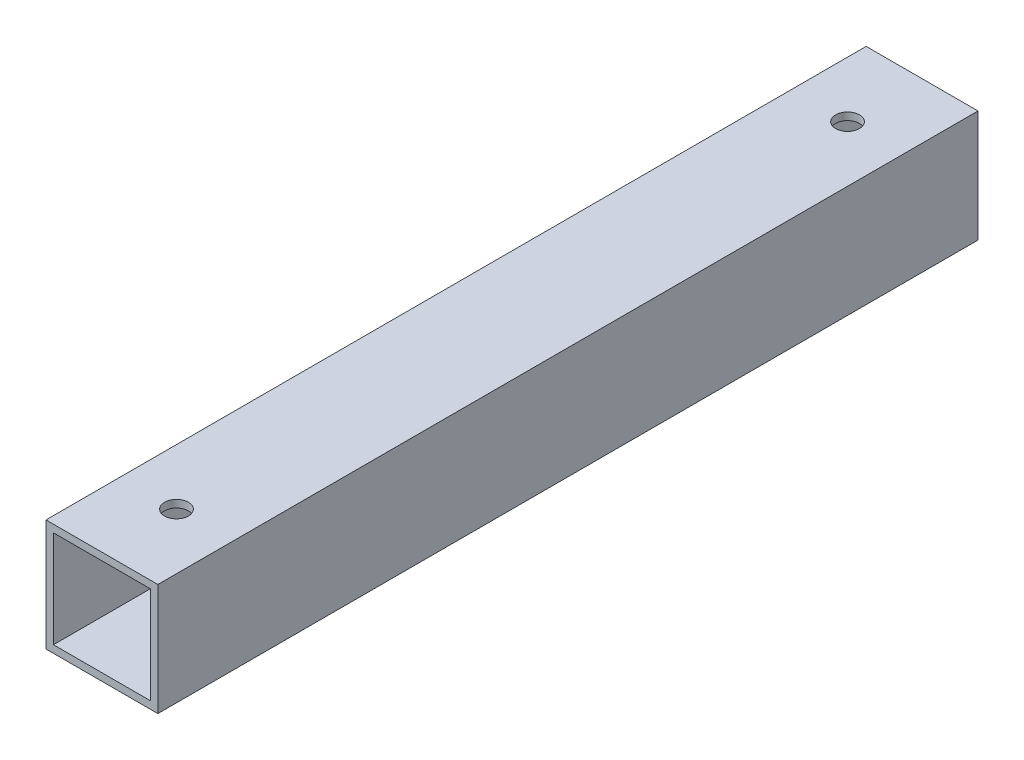
ISO-10303-21;
HEADER;
FILE_DESCRIPTION(('STEP AP214'),'2;1');
FILE_NAME('part.step','',(''),(''),'','','');
FILE_SCHEMA(('AUTOMOTIVE_DESIGN { 1 0 10303 214 1 1 1 1 }'));
ENDSEC;
DATA;
#1=APPLICATION_CONTEXT('core data for automotive mechanical design processes');
#2=APPLICATION_PROTOCOL_DEFINITION('international standard','automotive_design',2000,#1);
#3=PRODUCT_CONTEXT('',#1,'mechanical');
#4=PRODUCT('Part','Part','',(#3));
#5=PRODUCT_RELATED_PRODUCT_CATEGORY('part','',(#4));
#6=PRODUCT_DEFINITION_FORMATION('','',#4);
#7=PRODUCT_DEFINITION_CONTEXT('part definition',#1,'design');
#8=PRODUCT_DEFINITION('design','',#6,#7);
#9=PRODUCT_DEFINITION_SHAPE('','',#8);
#10=(LENGTH_UNIT() NAMED_UNIT(*) SI_UNIT(.MILLI.,.METRE.));
#11=(NAMED_UNIT(*) PLANE_ANGLE_UNIT() SI_UNIT($,.RADIAN.));
#12=(NAMED_UNIT(*) SI_UNIT($,.STERADIAN.) SOLID_ANGLE_UNIT());
#13=UNCERTAINTY_MEASURE_WITH_UNIT(LENGTH_MEASURE(1.E-05),#10,'distance_accuracy_value','');
#14=(GEOMETRIC_REPRESENTATION_CONTEXT(3) GLOBAL_UNCERTAINTY_ASSIGNED_CONTEXT((#13)) GLOBAL_UNIT_ASSIGNED_CONTEXT((#10,
#11,#12)) REPRESENTATION_CONTEXT('',''));
#15=CARTESIAN_POINT('',(0.,0.,0.));
#16=DIRECTION('',(0.,0.,1.));
#17=DIRECTION('',(1.,0.,0.));
#18=AXIS2_PLACEMENT_3D('',#15,#16,#17);
#19=CARTESIAN_POINT('',(0.,0.,110.));
#20=DIRECTION('',(0.,0.,1.));
#21=DIRECTION('',(1.,0.,0.));
#22=AXIS2_PLACEMENT_3D('',#19,#20,#21);
#23=PLANE('',#22);
#24=DIRECTION('',(0.,-1.,0.));
#25=VECTOR('',#24,1.);
#26=CARTESIAN_POINT('',(-1.,0.,110.));
#27=LINE('',#26,#25);
#28=CARTESIAN_POINT('',(-1.,14.,110.));
#29=VERTEX_POINT('',#28);
#30=CARTESIAN_POINT('',(-1.,-1.,110.));
#31=VERTEX_POINT('',#30);
#32=EDGE_CURVE('E163',#29,#31,#27,.T.);
#33=ORIENTED_EDGE('',*,*,#32,.T.);
#34=DIRECTION('',(1.,0.,0.));
#35=VECTOR('',#34,1.);
#36=CARTESIAN_POINT('',(0.,-1.,110.));
#37=LINE('',#36,#35);
#38=CARTESIAN_POINT('',(14.,-1.,110.));
#39=VERTEX_POINT('',#38);
#40=EDGE_CURVE('E166',#31,#39,#37,.T.);
#41=ORIENTED_EDGE('',*,*,#40,.T.);
#42=DIRECTION('',(0.,1.,0.));
#43=VECTOR('',#42,1.);
#44=CARTESIAN_POINT('',(14.,0.,110.));
#45=LINE('',#44,#43);
#46=CARTESIAN_POINT('',(14.,14.,110.));
#47=VERTEX_POINT('',#46);
#48=EDGE_CURVE('E169',#39,#47,#45,.T.);
#49=ORIENTED_EDGE('',*,*,#48,.T.);
#50=DIRECTION('',(-1.,0.,0.));
#51=VECTOR('',#50,1.);
#52=CARTESIAN_POINT('',(0.,14.,110.));
#53=LINE('',#52,#51);
#54=EDGE_CURVE('E171',#47,#29,#53,.T.);
#55=ORIENTED_EDGE('',*,*,#54,.T.);
#56=EDGE_LOOP('',(#33,#41,#49,#55));
#57=FACE_BOUND('',#56,.T.);
#58=DIRECTION('',(1.,0.,0.));
#59=VECTOR('',#58,1.);
#60=CARTESIAN_POINT('',(0.,0.,110.));
#61=LINE('',#60,#59);
#62=CARTESIAN_POINT('',(0.,0.,110.));
#63=VERTEX_POINT('',#62);
#64=CARTESIAN_POINT('',(13.,0.,110.));
#65=VERTEX_POINT('',#64);
#66=EDGE_CURVE('E133',#63,#65,#61,.T.);
#67=ORIENTED_EDGE('',*,*,#66,.F.);
#68=DIRECTION('',(0.,-1.,0.));
#69=VECTOR('',#68,1.);
#70=CARTESIAN_POINT('',(0.,0.,110.));
#71=LINE('',#70,#69);
#72=CARTESIAN_POINT('',(0.,13.,110.));
#73=VERTEX_POINT('',#72);
#74=EDGE_CURVE('E125',#73,#63,#71,.T.);
#75=ORIENTED_EDGE('',*,*,#74,.F.);
#76=DIRECTION('',(-1.,0.,0.));
#77=VECTOR('',#76,1.);
#78=CARTESIAN_POINT('',(0.,13.,110.));
#79=LINE('',#78,#77);
#80=CARTESIAN_POINT('',(13.,13.,110.));
#81=VERTEX_POINT('',#80);
#82=EDGE_CURVE('E147',#81,#73,#79,.T.);
#83=ORIENTED_EDGE('',*,*,#82,.F.);
#84=DIRECTION('',(0.,1.,0.));
#85=VECTOR('',#84,1.);
#86=CARTESIAN_POINT('',(13.,0.,110.));
#87=LINE('',#86,#85);
#88=EDGE_CURVE('E145',#65,#81,#87,.T.);
#89=ORIENTED_EDGE('',*,*,#88,.F.);
#90=EDGE_LOOP('',(#67,#75,#83,#89));
#91=FACE_BOUND('',#90,.T.);
#92=ADVANCED_FACE('F58',(#57,#91),#23,.T.);
#93=CARTESIAN_POINT('',(0.,0.,0.));
#94=DIRECTION('',(0.,0.,1.));
#95=DIRECTION('',(1.,0.,0.));
#96=AXIS2_PLACEMENT_3D('',#93,#94,#95);
#97=PLANE('',#96);
#98=DIRECTION('',(0.,-1.,0.));
#99=VECTOR('',#98,1.);
#100=CARTESIAN_POINT('',(-1.,0.,0.));
#101=LINE('',#100,#99);
#102=CARTESIAN_POINT('',(-1.,14.,0.));
#103=VERTEX_POINT('',#102);
#104=CARTESIAN_POINT('',(-1.,-1.,0.));
#105=VERTEX_POINT('',#104);
#106=EDGE_CURVE('E141',#103,#105,#101,.T.);
#107=ORIENTED_EDGE('',*,*,#106,.F.);
#108=DIRECTION('',(-1.,0.,0.));
#109=VECTOR('',#108,1.);
#110=CARTESIAN_POINT('',(0.,14.,0.));
#111=LINE('',#110,#109);
#112=CARTESIAN_POINT('',(14.,14.,0.));
#113=VERTEX_POINT('',#112);
#114=EDGE_CURVE('E167',#113,#103,#111,.T.);
#115=ORIENTED_EDGE('',*,*,#114,.F.);
#116=DIRECTION('',(0.,1.,0.));
#117=VECTOR('',#116,1.);
#118=CARTESIAN_POINT('',(14.,0.,0.));
#119=LINE('',#118,#117);
#120=CARTESIAN_POINT('',(14.,-1.,0.));
#121=VERTEX_POINT('',#120);
#122=EDGE_CURVE('E178',#121,#113,#119,.T.);
#123=ORIENTED_EDGE('',*,*,#122,.F.);
#124=DIRECTION('',(1.,0.,0.));
#125=VECTOR('',#124,1.);
#126=CARTESIAN_POINT('',(0.,-1.,0.));
#127=LINE('',#126,#125);
#128=EDGE_CURVE('E176',#105,#121,#127,.T.);
#129=ORIENTED_EDGE('',*,*,#128,.F.);
#130=EDGE_LOOP('',(#107,#115,#123,#129));
#131=FACE_BOUND('',#130,.T.);
#132=DIRECTION('',(0.,-1.,0.));
#133=VECTOR('',#132,1.);
#134=CARTESIAN_POINT('',(0.,0.,0.));
#135=LINE('',#134,#133);
#136=CARTESIAN_POINT('',(0.,13.,0.));
#137=VERTEX_POINT('',#136);
#138=CARTESIAN_POINT('',(0.,0.,0.));
#139=VERTEX_POINT('',#138);
#140=EDGE_CURVE('E83',#137,#139,#135,.T.);
#141=ORIENTED_EDGE('',*,*,#140,.T.);
#142=DIRECTION('',(1.,0.,0.));
#143=VECTOR('',#142,1.);
#144=CARTESIAN_POINT('',(0.,0.,0.));
#145=LINE('',#144,#143);
#146=CARTESIAN_POINT('',(13.,0.,0.));
#147=VERTEX_POINT('',#146);
#148=EDGE_CURVE('E140',#139,#147,#145,.T.);
#149=ORIENTED_EDGE('',*,*,#148,.T.);
#150=DIRECTION('',(0.,1.,0.));
#151=VECTOR('',#150,1.);
#152=CARTESIAN_POINT('',(13.,0.,0.));
#153=LINE('',#152,#151);
#154=CARTESIAN_POINT('',(13.,13.,0.));
#155=VERTEX_POINT('',#154);
#156=EDGE_CURVE('E155',#147,#155,#153,.T.);
#157=ORIENTED_EDGE('',*,*,#156,.T.);
#158=DIRECTION('',(-1.,0.,0.));
#159=VECTOR('',#158,1.);
#160=CARTESIAN_POINT('',(0.,13.,0.));
#161=LINE('',#160,#159);
#162=EDGE_CURVE('E134',#155,#137,#161,.T.);
#163=ORIENTED_EDGE('',*,*,#162,.T.);
#164=EDGE_LOOP('',(#141,#149,#157,#163));
#165=FACE_BOUND('',#164,.T.);
#166=ADVANCED_FACE('F229',(#131,#165),#97,.F.);
#167=CARTESIAN_POINT('',(-1.,0.,110.));
#168=DIRECTION('',(1.,0.,0.));
#169=DIRECTION('',(0.,1.,0.));
#170=AXIS2_PLACEMENT_3D('',#167,#168,#169);
#171=PLANE('',#170);
#172=ORIENTED_EDGE('',*,*,#106,.T.);
#173=DIRECTION('',(0.,0.,-1.));
#174=VECTOR('',#173,1.);
#175=CARTESIAN_POINT('',(-1.,-1.,110.));
#176=LINE('',#175,#174);
#177=EDGE_CURVE('E12',#31,#105,#176,.T.);
#178=ORIENTED_EDGE('',*,*,#177,.F.);
#179=ORIENTED_EDGE('',*,*,#32,.F.);
#180=DIRECTION('',(0.,0.,-1.));
#181=VECTOR('',#180,1.);
#182=CARTESIAN_POINT('',(-1.,14.,110.));
#183=LINE('',#182,#181);
#184=EDGE_CURVE('E173',#29,#103,#183,.T.);
#185=ORIENTED_EDGE('',*,*,#184,.T.);
#186=EDGE_LOOP('',(#172,#178,#179,#185));
#187=FACE_BOUND('',#186,.T.);
#188=ADVANCED_FACE('F60',(#187),#171,.F.);
#189=CARTESIAN_POINT('',(0.,-1.,110.));
#190=DIRECTION('',(0.,1.,0.));
#191=DIRECTION('',(0.,0.,1.));
#192=AXIS2_PLACEMENT_3D('',#189,#190,#191);
#193=PLANE('',#192);
#194=CARTESIAN_POINT('',(6.5,-1.,10.));
#195=DIRECTION('',(0.,1.,0.));
#196=DIRECTION('',(0.,0.,1.));
#197=AXIS2_PLACEMENT_3D('',#194,#195,#196);
#198=CIRCLE('',#197,1.6);
#199=CARTESIAN_POINT('',(6.5,-1.,11.6));
#200=VERTEX_POINT('',#199);
#201=EDGE_CURVE('E153',#200,#200,#198,.T.);
#202=ORIENTED_EDGE('',*,*,#201,.T.);
#203=EDGE_LOOP('',(#202));
#204=FACE_BOUND('',#203,.T.);
#205=CARTESIAN_POINT('',(6.5,-1.,100.));
#206=DIRECTION('',(0.,1.,0.));
#207=DIRECTION('',(0.,0.,1.));
#208=AXIS2_PLACEMENT_3D('',#205,#206,#207);
#209=CIRCLE('',#208,1.6);
#210=CARTESIAN_POINT('',(6.5,-1.,101.6));
#211=VERTEX_POINT('',#210);
#212=EDGE_CURVE('E194',#211,#211,#209,.T.);
#213=ORIENTED_EDGE('',*,*,#212,.T.);
#214=EDGE_LOOP('',(#213));
#215=FACE_BOUND('',#214,.T.);
#216=ORIENTED_EDGE('',*,*,#128,.T.);
#217=DIRECTION('',(0.,0.,-1.));
#218=VECTOR('',#217,1.);
#219=CARTESIAN_POINT('',(14.,-1.,110.));
#220=LINE('',#219,#218);
#221=EDGE_CURVE('E67',#39,#121,#220,.T.);
#222=ORIENTED_EDGE('',*,*,#221,.F.);
#223=ORIENTED_EDGE('',*,*,#40,.F.);
#224=ORIENTED_EDGE('',*,*,#177,.T.);
#225=EDGE_LOOP('',(#216,#222,#223,#224));
#226=FACE_BOUND('',#225,.T.);
#227=ADVANCED_FACE('F211',(#204,#215,#226),#193,.F.);
#228=CARTESIAN_POINT('',(14.,0.,110.));
#229=DIRECTION('',(-1.,0.,0.));
#230=DIRECTION('',(0.,-1.,0.));
#231=AXIS2_PLACEMENT_3D('',#228,#229,#230);
#232=PLANE('',#231);
#233=ORIENTED_EDGE('',*,*,#122,.T.);
#234=DIRECTION('',(0.,0.,-1.));
#235=VECTOR('',#234,1.);
#236=CARTESIAN_POINT('',(14.,14.,110.));
#237=LINE('',#236,#235);
#238=EDGE_CURVE('E183',#47,#113,#237,.T.);
#239=ORIENTED_EDGE('',*,*,#238,.F.);
#240=ORIENTED_EDGE('',*,*,#48,.F.);
#241=ORIENTED_EDGE('',*,*,#221,.T.);
#242=EDGE_LOOP('',(#233,#239,#240,#241));
#243=FACE_BOUND('',#242,.T.);
#244=ADVANCED_FACE('F243',(#243),#232,.F.);
#245=CARTESIAN_POINT('',(0.,14.,110.));
#246=DIRECTION('',(0.,-1.,0.));
#247=DIRECTION('',(0.,0.,-1.));
#248=AXIS2_PLACEMENT_3D('',#245,#246,#247);
#249=PLANE('',#248);
#250=CARTESIAN_POINT('',(6.5,14.,10.));
#251=DIRECTION('',(0.,1.,0.));
#252=DIRECTION('',(0.,0.,1.));
#253=AXIS2_PLACEMENT_3D('',#250,#251,#252);
#254=CIRCLE('',#253,1.6);
#255=CARTESIAN_POINT('',(6.5,14.,11.6));
#256=VERTEX_POINT('',#255);
#257=EDGE_CURVE('E190',#256,#256,#254,.T.);
#258=ORIENTED_EDGE('',*,*,#257,.F.);
#259=EDGE_LOOP('',(#258));
#260=FACE_BOUND('',#259,.T.);
#261=CARTESIAN_POINT('',(6.5,14.,100.));
#262=DIRECTION('',(0.,1.,0.));
#263=DIRECTION('',(0.,0.,1.));
#264=AXIS2_PLACEMENT_3D('',#261,#262,#263);
#265=CIRCLE('',#264,1.6);
#266=CARTESIAN_POINT('',(6.5,14.,101.6));
#267=VERTEX_POINT('',#266);
#268=EDGE_CURVE('E197',#267,#267,#265,.T.);
#269=ORIENTED_EDGE('',*,*,#268,.F.);
#270=EDGE_LOOP('',(#269));
#271=FACE_BOUND('',#270,.T.);
#272=ORIENTED_EDGE('',*,*,#114,.T.);
#273=ORIENTED_EDGE('',*,*,#184,.F.);
#274=ORIENTED_EDGE('',*,*,#54,.F.);
#275=ORIENTED_EDGE('',*,*,#238,.T.);
#276=EDGE_LOOP('',(#272,#273,#274,#275));
#277=FACE_BOUND('',#276,.T.);
#278=ADVANCED_FACE('F240',(#260,#271,#277),#249,.F.);
#279=CARTESIAN_POINT('',(0.,0.,110.));
#280=DIRECTION('',(1.,0.,0.));
#281=DIRECTION('',(0.,1.,0.));
#282=AXIS2_PLACEMENT_3D('',#279,#280,#281);
#283=PLANE('',#282);
#284=ORIENTED_EDGE('',*,*,#140,.F.);
#285=DIRECTION('',(0.,0.,-1.));
#286=VECTOR('',#285,1.);
#287=CARTESIAN_POINT('',(0.,13.,110.));
#288=LINE('',#287,#286);
#289=EDGE_CURVE('E129',#73,#137,#288,.T.);
#290=ORIENTED_EDGE('',*,*,#289,.F.);
#291=ORIENTED_EDGE('',*,*,#74,.T.);
#292=DIRECTION('',(0.,0.,-1.));
#293=VECTOR('',#292,1.);
#294=CARTESIAN_POINT('',(0.,0.,110.));
#295=LINE('',#294,#293);
#296=EDGE_CURVE('E128',#63,#139,#295,.T.);
#297=ORIENTED_EDGE('',*,*,#296,.T.);
#298=EDGE_LOOP('',(#284,#290,#291,#297));
#299=FACE_BOUND('',#298,.T.);
#300=ADVANCED_FACE('F127',(#299),#283,.T.);
#301=CARTESIAN_POINT('',(0.,0.,110.));
#302=DIRECTION('',(0.,1.,0.));
#303=DIRECTION('',(0.,0.,1.));
#304=AXIS2_PLACEMENT_3D('',#301,#302,#303);
#305=PLANE('',#304);
#306=CARTESIAN_POINT('',(6.5,0.,10.));
#307=DIRECTION('',(0.,1.,0.));
#308=DIRECTION('',(0.,0.,1.));
#309=AXIS2_PLACEMENT_3D('',#306,#307,#308);
#310=CIRCLE('',#309,1.6);
#311=CARTESIAN_POINT('',(6.5,0.,11.6));
#312=VERTEX_POINT('',#311);
#313=EDGE_CURVE('E206',#312,#312,#310,.T.);
#314=ORIENTED_EDGE('',*,*,#313,.F.);
#315=EDGE_LOOP('',(#314));
#316=FACE_BOUND('',#315,.T.);
#317=CARTESIAN_POINT('',(6.5,0.,100.));
#318=DIRECTION('',(0.,1.,0.));
#319=DIRECTION('',(0.,0.,1.));
#320=AXIS2_PLACEMENT_3D('',#317,#318,#319);
#321=CIRCLE('',#320,1.6);
#322=CARTESIAN_POINT('',(6.5,0.,101.6));
#323=VERTEX_POINT('',#322);
#324=EDGE_CURVE('E189',#323,#323,#321,.T.);
#325=ORIENTED_EDGE('',*,*,#324,.F.);
#326=EDGE_LOOP('',(#325));
#327=FACE_BOUND('',#326,.T.);
#328=ORIENTED_EDGE('',*,*,#148,.F.);
#329=ORIENTED_EDGE('',*,*,#296,.F.);
#330=ORIENTED_EDGE('',*,*,#66,.T.);
#331=DIRECTION('',(0.,0.,-1.));
#332=VECTOR('',#331,1.);
#333=CARTESIAN_POINT('',(13.,0.,110.));
#334=LINE('',#333,#332);
#335=EDGE_CURVE('E142',#65,#147,#334,.T.);
#336=ORIENTED_EDGE('',*,*,#335,.T.);
#337=EDGE_LOOP('',(#328,#329,#330,#336));
#338=FACE_BOUND('',#337,.T.);
#339=ADVANCED_FACE('F137',(#316,#327,#338),#305,.T.);
#340=CARTESIAN_POINT('',(13.,0.,110.));
#341=DIRECTION('',(-1.,0.,0.));
#342=DIRECTION('',(0.,-1.,0.));
#343=AXIS2_PLACEMENT_3D('',#340,#341,#342);
#344=PLANE('',#343);
#345=ORIENTED_EDGE('',*,*,#156,.F.);
#346=ORIENTED_EDGE('',*,*,#335,.F.);
#347=ORIENTED_EDGE('',*,*,#88,.T.);
#348=DIRECTION('',(0.,0.,-1.));
#349=VECTOR('',#348,1.);
#350=CARTESIAN_POINT('',(13.,13.,110.));
#351=LINE('',#350,#349);
#352=EDGE_CURVE('E75',#81,#155,#351,.T.);
#353=ORIENTED_EDGE('',*,*,#352,.T.);
#354=EDGE_LOOP('',(#345,#346,#347,#353));
#355=FACE_BOUND('',#354,.T.);
#356=ADVANCED_FACE('F270',(#355),#344,.T.);
#357=CARTESIAN_POINT('',(0.,13.,110.));
#358=DIRECTION('',(0.,-1.,0.));
#359=DIRECTION('',(0.,0.,-1.));
#360=AXIS2_PLACEMENT_3D('',#357,#358,#359);
#361=PLANE('',#360);
#362=CARTESIAN_POINT('',(6.5,13.,10.));
#363=DIRECTION('',(0.,-1.,0.));
#364=DIRECTION('',(0.,0.,-1.));
#365=AXIS2_PLACEMENT_3D('',#362,#363,#364);
#366=CIRCLE('',#365,1.6);
#367=CARTESIAN_POINT('',(6.5,13.,8.4));
#368=VERTEX_POINT('',#367);
#369=EDGE_CURVE('E62',#368,#368,#366,.T.);
#370=ORIENTED_EDGE('',*,*,#369,.F.);
#371=EDGE_LOOP('',(#370));
#372=FACE_BOUND('',#371,.T.);
#373=CARTESIAN_POINT('',(6.5,13.,100.));
#374=DIRECTION('',(0.,-1.,0.));
#375=DIRECTION('',(0.,0.,-1.));
#376=AXIS2_PLACEMENT_3D('',#373,#374,#375);
#377=CIRCLE('',#376,1.6);
#378=CARTESIAN_POINT('',(6.5,13.,98.4));
#379=VERTEX_POINT('',#378);
#380=EDGE_CURVE('E187',#379,#379,#377,.T.);
#381=ORIENTED_EDGE('',*,*,#380,.F.);
#382=EDGE_LOOP('',(#381));
#383=FACE_BOUND('',#382,.T.);
#384=ORIENTED_EDGE('',*,*,#162,.F.);
#385=ORIENTED_EDGE('',*,*,#352,.F.);
#386=ORIENTED_EDGE('',*,*,#82,.T.);
#387=ORIENTED_EDGE('',*,*,#289,.T.);
#388=EDGE_LOOP('',(#384,#385,#386,#387));
#389=FACE_BOUND('',#388,.T.);
#390=ADVANCED_FACE('F268',(#372,#383,#389),#361,.T.);
#391=CARTESIAN_POINT('',(6.5,-18.,100.));
#392=DIRECTION('',(0.,1.,0.));
#393=DIRECTION('',(0.,0.,1.));
#394=AXIS2_PLACEMENT_3D('',#391,#392,#393);
#395=CYLINDRICAL_SURFACE('',#394,1.6);
#396=ORIENTED_EDGE('',*,*,#380,.T.);
#397=EDGE_LOOP('',(#396));
#398=FACE_BOUND('',#397,.T.);
#399=ORIENTED_EDGE('',*,*,#268,.T.);
#400=EDGE_LOOP('',(#399));
#401=FACE_BOUND('',#400,.T.);
#402=ADVANCED_FACE('F225',(#398,#401),#395,.F.);
#403=CARTESIAN_POINT('',(6.5,-18.,10.));
#404=DIRECTION('',(0.,1.,0.));
#405=DIRECTION('',(0.,0.,1.));
#406=AXIS2_PLACEMENT_3D('',#403,#404,#405);
#407=CYLINDRICAL_SURFACE('',#406,1.6);
#408=ORIENTED_EDGE('',*,*,#369,.T.);
#409=EDGE_LOOP('',(#408));
#410=FACE_BOUND('',#409,.T.);
#411=ORIENTED_EDGE('',*,*,#257,.T.);
#412=EDGE_LOOP('',(#411));
#413=FACE_BOUND('',#412,.T.);
#414=ADVANCED_FACE('F219',(#410,#413),#407,.F.);
#415=ORIENTED_EDGE('',*,*,#324,.T.);
#416=EDGE_LOOP('',(#415));
#417=FACE_BOUND('',#416,.T.);
#418=ORIENTED_EDGE('',*,*,#212,.F.);
#419=EDGE_LOOP('',(#418));
#420=FACE_BOUND('',#419,.T.);
#421=ADVANCED_FACE('F216',(#417,#420),#395,.F.);
#422=ORIENTED_EDGE('',*,*,#313,.T.);
#423=EDGE_LOOP('',(#422));
#424=FACE_BOUND('',#423,.T.);
#425=ORIENTED_EDGE('',*,*,#201,.F.);
#426=EDGE_LOOP('',(#425));
#427=FACE_BOUND('',#426,.T.);
#428=ADVANCED_FACE('F214',(#424,#427),#407,.F.);
#429=CLOSED_SHELL('',(#92,#166,#188,#227,#244,#278,#300,#339,#356,#390,#402,#414,#421,#428));
#430=MANIFOLD_SOLID_BREP('B2',#429);
#431=ADVANCED_BREP_SHAPE_REPRESENTATION('',(#18,#430),#14);
#432=SHAPE_DEFINITION_REPRESENTATION(#9,#431);
ENDSEC;
END-ISO-10303-21;
